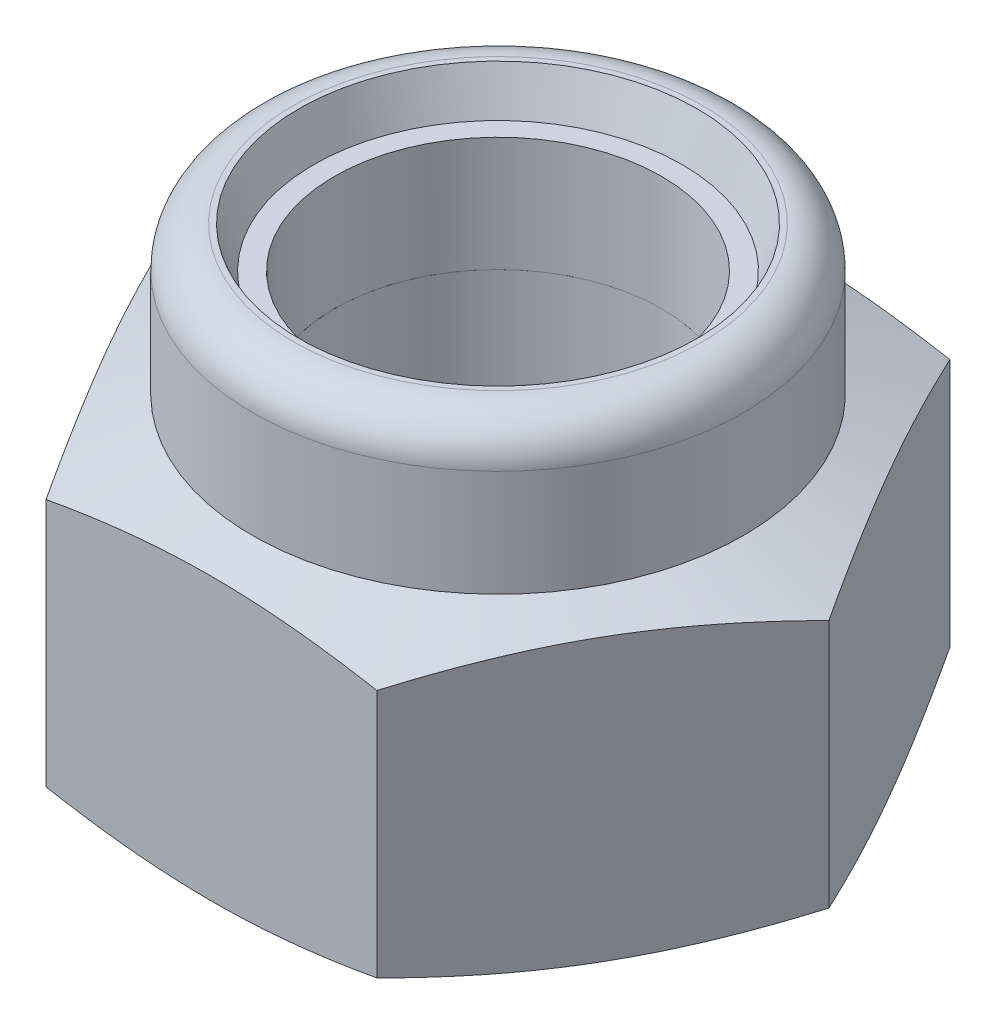
ISO-10303-21;
HEADER;
FILE_DESCRIPTION(('STEP AP214'),'2;1');
FILE_NAME('part.step','',(''),(''),'','','');
FILE_SCHEMA(('AUTOMOTIVE_DESIGN { 1 0 10303 214 1 1 1 1 }'));
ENDSEC;
DATA;
#1=APPLICATION_CONTEXT('core data for automotive mechanical design processes');
#2=APPLICATION_PROTOCOL_DEFINITION('international standard','automotive_design',2000,#1);
#3=PRODUCT_CONTEXT('',#1,'mechanical');
#4=PRODUCT('Part','Part','',(#3));
#5=PRODUCT_RELATED_PRODUCT_CATEGORY('part','',(#4));
#6=PRODUCT_DEFINITION_FORMATION('','',#4);
#7=PRODUCT_DEFINITION_CONTEXT('part definition',#1,'design');
#8=PRODUCT_DEFINITION('design','',#6,#7);
#9=PRODUCT_DEFINITION_SHAPE('','',#8);
#10=(LENGTH_UNIT() NAMED_UNIT(*) SI_UNIT(.MILLI.,.METRE.));
#11=(NAMED_UNIT(*) PLANE_ANGLE_UNIT() SI_UNIT($,.RADIAN.));
#12=(NAMED_UNIT(*) SI_UNIT($,.STERADIAN.) SOLID_ANGLE_UNIT());
#13=UNCERTAINTY_MEASURE_WITH_UNIT(LENGTH_MEASURE(1.E-05),#10,'distance_accuracy_value','');
#14=(GEOMETRIC_REPRESENTATION_CONTEXT(3) GLOBAL_UNCERTAINTY_ASSIGNED_CONTEXT((#13)) GLOBAL_UNIT_ASSIGNED_CONTEXT((#10,
#11,#12)) REPRESENTATION_CONTEXT('',''));
#15=CARTESIAN_POINT('',(0.,0.,0.));
#16=DIRECTION('',(0.,0.,1.));
#17=DIRECTION('',(1.,0.,0.));
#18=AXIS2_PLACEMENT_3D('',#15,#16,#17);
#19=CARTESIAN_POINT('',(0.,3.7,0.));
#20=DIRECTION('',(0.,1.,0.));
#21=DIRECTION('',(0.,0.,1.));
#22=AXIS2_PLACEMENT_3D('',#19,#20,#21);
#23=PLANE('',#22);
#24=CARTESIAN_POINT('',(0.,3.7,0.));
#25=DIRECTION('',(0.,1.,0.));
#26=DIRECTION('',(0.,0.,1.));
#27=AXIS2_PLACEMENT_3D('',#24,#25,#26);
#28=CIRCLE('',#27,2.5);
#29=CARTESIAN_POINT('',(0.,3.7,2.5));
#30=VERTEX_POINT('',#29);
#31=EDGE_CURVE('E58',#30,#30,#28,.T.);
#32=ORIENTED_EDGE('',*,*,#31,.F.);
#33=EDGE_LOOP('',(#32));
#34=FACE_BOUND('',#33,.T.);
#35=CARTESIAN_POINT('',(0.,3.7,0.));
#36=DIRECTION('',(0.,1.,0.));
#37=DIRECTION('',(0.,0.,1.));
#38=AXIS2_PLACEMENT_3D('',#35,#36,#37);
#39=CIRCLE('',#38,2.);
#40=CARTESIAN_POINT('',(0.,3.7,2.));
#41=VERTEX_POINT('',#40);
#42=EDGE_CURVE('E67',#41,#41,#39,.T.);
#43=ORIENTED_EDGE('',*,*,#42,.T.);
#44=EDGE_LOOP('',(#43));
#45=FACE_BOUND('',#44,.T.);
#46=ADVANCED_FACE('F51',(#34,#45),#23,.F.);
#47=CARTESIAN_POINT('',(0.,12.1710678118655,0.));
#48=DIRECTION('',(0.,-1.,0.));
#49=DIRECTION('',(0.,0.,-1.));
#50=AXIS2_PLACEMENT_3D('',#47,#48,#49);
#51=CYLINDRICAL_SURFACE('',#50,2.5);
#52=CARTESIAN_POINT('',(0.,5.1,0.));
#53=DIRECTION('',(0.,-1.,0.));
#54=DIRECTION('',(0.,0.,-1.));
#55=AXIS2_PLACEMENT_3D('',#52,#53,#54);
#56=CIRCLE('',#55,2.5);
#57=CARTESIAN_POINT('',(0.,5.1,-2.5));
#58=VERTEX_POINT('',#57);
#59=EDGE_CURVE('E62',#58,#58,#56,.T.);
#60=ORIENTED_EDGE('',*,*,#59,.T.);
#61=EDGE_LOOP('',(#60));
#62=FACE_BOUND('',#61,.T.);
#63=ORIENTED_EDGE('',*,*,#31,.T.);
#64=EDGE_LOOP('',(#63));
#65=FACE_BOUND('',#64,.T.);
#66=ADVANCED_FACE('F75',(#62,#65),#51,.T.);
#67=CARTESIAN_POINT('',(0.,12.1710678118655,0.));
#68=DIRECTION('',(0.,-1.,0.));
#69=DIRECTION('',(0.,0.,-1.));
#70=AXIS2_PLACEMENT_3D('',#67,#68,#69);
#71=CYLINDRICAL_SURFACE('',#70,2.);
#72=CARTESIAN_POINT('',(0.,5.1,0.));
#73=DIRECTION('',(0.,-1.,0.));
#74=DIRECTION('',(0.,0.,-1.));
#75=AXIS2_PLACEMENT_3D('',#72,#73,#74);
#76=CIRCLE('',#75,2.);
#77=CARTESIAN_POINT('',(0.,5.1,-2.));
#78=VERTEX_POINT('',#77);
#79=EDGE_CURVE('E11',#78,#78,#76,.T.);
#80=ORIENTED_EDGE('',*,*,#79,.F.);
#81=EDGE_LOOP('',(#80));
#82=FACE_BOUND('',#81,.T.);
#83=ORIENTED_EDGE('',*,*,#42,.F.);
#84=EDGE_LOOP('',(#83));
#85=FACE_BOUND('',#84,.T.);
#86=ADVANCED_FACE('F73',(#82,#85),#71,.F.);
#87=CARTESIAN_POINT('',(2.5,5.1,0.));
#88=DIRECTION('',(0.,-1.,0.));
#89=DIRECTION('',(0.,0.,-1.));
#90=AXIS2_PLACEMENT_3D('',#87,#88,#89);
#91=PLANE('',#90);
#92=ORIENTED_EDGE('',*,*,#79,.T.);
#93=EDGE_LOOP('',(#92));
#94=FACE_BOUND('',#93,.T.);
#95=ORIENTED_EDGE('',*,*,#59,.F.);
#96=EDGE_LOOP('',(#95));
#97=FACE_BOUND('',#96,.T.);
#98=ADVANCED_FACE('F53',(#94,#97),#91,.F.);
#99=CLOSED_SHELL('',(#46,#66,#86,#98));
#100=MANIFOLD_SOLID_BREP('B2',#99);
#101=CARTESIAN_POINT('',(0.,0.17320508075689,0.));
#102=DIRECTION('',(0.,-1.,0.));
#103=DIRECTION('',(0.,0.,-1.));
#104=AXIS2_PLACEMENT_3D('',#101,#102,#103);
#105=CONICAL_SURFACE('',#104,2.,1.04719755119659);
#106=CARTESIAN_POINT('',(0.,0.,0.));
#107=DIRECTION('',(0.,-1.,0.));
#108=DIRECTION('',(0.,0.,-1.));
#109=AXIS2_PLACEMENT_3D('',#106,#107,#108);
#110=CIRCLE('',#109,2.3);
#111=CARTESIAN_POINT('',(0.,0.,-2.3));
#112=VERTEX_POINT('',#111);
#113=EDGE_CURVE('E222',#112,#112,#110,.T.);
#114=ORIENTED_EDGE('',*,*,#113,.T.);
#115=EDGE_LOOP('',(#114));
#116=FACE_BOUND('',#115,.T.);
#117=CARTESIAN_POINT('',(0.,0.17320508075689,0.));
#118=DIRECTION('',(0.,-1.,0.));
#119=DIRECTION('',(0.,0.,-1.));
#120=AXIS2_PLACEMENT_3D('',#117,#118,#119);
#121=CIRCLE('',#120,2.);
#122=CARTESIAN_POINT('',(0.,0.17320508075689,-2.));
#123=VERTEX_POINT('',#122);
#124=EDGE_CURVE('E193',#123,#123,#121,.T.);
#125=ORIENTED_EDGE('',*,*,#124,.F.);
#126=EDGE_LOOP('',(#125));
#127=FACE_BOUND('',#126,.T.);
#128=ADVANCED_FACE('F113',(#116,#127),#105,.F.);
#129=CARTESIAN_POINT('',(2.3,0.,0.));
#130=DIRECTION('',(0.,-1.,0.));
#131=DIRECTION('',(0.,0.,-1.));
#132=AXIS2_PLACEMENT_3D('',#129,#130,#131);
#133=PLANE('',#132);
#134=CARTESIAN_POINT('',(0.,0.,0.));
#135=DIRECTION('',(0.,-1.,0.));
#136=DIRECTION('',(0.,0.,-1.));
#137=AXIS2_PLACEMENT_3D('',#134,#135,#136);
#138=CIRCLE('',#137,3.);
#139=CARTESIAN_POINT('',(0.,0.,-3.));
#140=VERTEX_POINT('',#139);
#141=EDGE_CURVE('E316',#140,#140,#138,.T.);
#142=ORIENTED_EDGE('',*,*,#141,.T.);
#143=EDGE_LOOP('',(#142));
#144=FACE_BOUND('',#143,.T.);
#145=ORIENTED_EDGE('',*,*,#113,.F.);
#146=EDGE_LOOP('',(#145));
#147=FACE_BOUND('',#146,.T.);
#148=ADVANCED_FACE('F323',(#144,#147),#133,.T.);
#149=CARTESIAN_POINT('',(0.,-0.041635430402974,0.));
#150=DIRECTION('',(0.,-1.,0.));
#151=DIRECTION('',(0.,0.,-1.));
#152=AXIS2_PLACEMENT_3D('',#149,#150,#151);
#153=CYLINDRICAL_SURFACE('',#152,3.);
#154=CARTESIAN_POINT('',(0.,3.8,0.));
#155=DIRECTION('',(0.,-1.,0.));
#156=DIRECTION('',(0.,0.,-1.));
#157=AXIS2_PLACEMENT_3D('',#154,#155,#156);
#158=CIRCLE('',#157,3.);
#159=CARTESIAN_POINT('',(0.,3.8,-3.));
#160=VERTEX_POINT('',#159);
#161=EDGE_CURVE('E314',#160,#160,#158,.T.);
#162=ORIENTED_EDGE('',*,*,#161,.F.);
#163=EDGE_LOOP('',(#162));
#164=FACE_BOUND('',#163,.T.);
#165=CARTESIAN_POINT('',(0.,5.1,0.));
#166=DIRECTION('',(0.,-1.,0.));
#167=DIRECTION('',(0.,0.,-1.));
#168=AXIS2_PLACEMENT_3D('',#165,#166,#167);
#169=CIRCLE('',#168,3.);
#170=CARTESIAN_POINT('',(0.,5.1,-3.));
#171=VERTEX_POINT('',#170);
#172=EDGE_CURVE('E219',#171,#171,#169,.T.);
#173=ORIENTED_EDGE('',*,*,#172,.T.);
#174=EDGE_LOOP('',(#173));
#175=FACE_BOUND('',#174,.T.);
#176=ADVANCED_FACE('F326',(#164,#175),#153,.T.);
#177=CARTESIAN_POINT('',(0.,5.1,0.));
#178=DIRECTION('',(0.,-1.,0.));
#179=DIRECTION('',(0.,0.,-1.));
#180=AXIS2_PLACEMENT_3D('',#177,#178,#179);
#181=TOROIDAL_SURFACE('',#180,2.5,0.5);
#182=CARTESIAN_POINT('',(0.,5.6,0.));
#183=DIRECTION('',(0.,-1.,0.));
#184=DIRECTION('',(0.,0.,-1.));
#185=AXIS2_PLACEMENT_3D('',#182,#183,#184);
#186=CIRCLE('',#185,2.5);
#187=CARTESIAN_POINT('',(0.,5.6,-2.5));
#188=VERTEX_POINT('',#187);
#189=EDGE_CURVE('E216',#188,#188,#186,.T.);
#190=ORIENTED_EDGE('',*,*,#189,.T.);
#191=EDGE_LOOP('',(#190));
#192=FACE_BOUND('',#191,.T.);
#193=ORIENTED_EDGE('',*,*,#172,.F.);
#194=EDGE_LOOP('',(#193));
#195=FACE_BOUND('',#194,.T.);
#196=ADVANCED_FACE('F363',(#192,#195),#181,.T.);
#197=CARTESIAN_POINT('',(2.5,5.6,0.));
#198=DIRECTION('',(0.,1.,0.));
#199=DIRECTION('',(0.,0.,1.));
#200=AXIS2_PLACEMENT_3D('',#197,#198,#199);
#201=PLANE('',#200);
#202=CARTESIAN_POINT('',(0.,5.6,0.));
#203=DIRECTION('',(0.,-1.,0.));
#204=DIRECTION('',(0.,0.,-1.));
#205=AXIS2_PLACEMENT_3D('',#202,#203,#204);
#206=CIRCLE('',#205,2.4319851171331);
#207=CARTESIAN_POINT('',(0.,5.6,-2.4319851171331));
#208=VERTEX_POINT('',#207);
#209=EDGE_CURVE('E213',#208,#208,#206,.T.);
#210=ORIENTED_EDGE('',*,*,#209,.T.);
#211=EDGE_LOOP('',(#210));
#212=FACE_BOUND('',#211,.T.);
#213=ORIENTED_EDGE('',*,*,#189,.F.);
#214=EDGE_LOOP('',(#213));
#215=FACE_BOUND('',#214,.T.);
#216=ADVANCED_FACE('F359',(#212,#215),#201,.T.);
#217=CARTESIAN_POINT('',(0.,5.6,0.));
#218=DIRECTION('',(0.,1.,0.));
#219=DIRECTION('',(0.,0.,1.));
#220=AXIS2_PLACEMENT_3D('',#217,#218,#219);
#221=CONICAL_SURFACE('',#220,2.4319851171331,0.349065850398862);
#222=CARTESIAN_POINT('',(0.,5.1,0.));
#223=DIRECTION('',(0.,-1.,0.));
#224=DIRECTION('',(0.,0.,-1.));
#225=AXIS2_PLACEMENT_3D('',#222,#223,#224);
#226=CIRCLE('',#225,2.25);
#227=CARTESIAN_POINT('',(0.,5.1,-2.25));
#228=VERTEX_POINT('',#227);
#229=EDGE_CURVE('E210',#228,#228,#226,.T.);
#230=ORIENTED_EDGE('',*,*,#229,.T.);
#231=EDGE_LOOP('',(#230));
#232=FACE_BOUND('',#231,.T.);
#233=ORIENTED_EDGE('',*,*,#209,.F.);
#234=EDGE_LOOP('',(#233));
#235=FACE_BOUND('',#234,.T.);
#236=ADVANCED_FACE('F352',(#232,#235),#221,.F.);
#237=CARTESIAN_POINT('',(2.5,5.1,0.));
#238=DIRECTION('',(0.,-1.,0.));
#239=DIRECTION('',(0.,0.,-1.));
#240=AXIS2_PLACEMENT_3D('',#237,#238,#239);
#241=PLANE('',#240);
#242=CARTESIAN_POINT('',(0.,5.1,0.));
#243=DIRECTION('',(0.,-1.,0.));
#244=DIRECTION('',(0.,0.,-1.));
#245=AXIS2_PLACEMENT_3D('',#242,#243,#244);
#246=CIRCLE('',#245,2.5);
#247=CARTESIAN_POINT('',(0.,5.1,-2.5));
#248=VERTEX_POINT('',#247);
#249=EDGE_CURVE('E207',#248,#248,#246,.T.);
#250=ORIENTED_EDGE('',*,*,#249,.T.);
#251=EDGE_LOOP('',(#250));
#252=FACE_BOUND('',#251,.T.);
#253=ORIENTED_EDGE('',*,*,#229,.F.);
#254=EDGE_LOOP('',(#253));
#255=FACE_BOUND('',#254,.T.);
#256=ADVANCED_FACE('F345',(#252,#255),#241,.T.);
#257=CARTESIAN_POINT('',(0.,-0.041635430402974,0.));
#258=DIRECTION('',(0.,-1.,0.));
#259=DIRECTION('',(0.,0.,-1.));
#260=AXIS2_PLACEMENT_3D('',#257,#258,#259);
#261=CYLINDRICAL_SURFACE('',#260,2.5);
#262=ORIENTED_EDGE('',*,*,#249,.F.);
#263=EDGE_LOOP('',(#262));
#264=FACE_BOUND('',#263,.T.);
#265=CARTESIAN_POINT('',(0.,3.7,0.));
#266=DIRECTION('',(0.,-1.,0.));
#267=DIRECTION('',(0.,0.,-1.));
#268=AXIS2_PLACEMENT_3D('',#265,#266,#267);
#269=CIRCLE('',#268,2.5);
#270=CARTESIAN_POINT('',(0.,3.7,-2.5));
#271=VERTEX_POINT('',#270);
#272=EDGE_CURVE('E204',#271,#271,#269,.T.);
#273=ORIENTED_EDGE('',*,*,#272,.T.);
#274=EDGE_LOOP('',(#273));
#275=FACE_BOUND('',#274,.T.);
#276=ADVANCED_FACE('F340',(#264,#275),#261,.F.);
#277=CARTESIAN_POINT('',(2.,3.7,0.));
#278=DIRECTION('',(0.,1.,0.));
#279=DIRECTION('',(0.,0.,1.));
#280=AXIS2_PLACEMENT_3D('',#277,#278,#279);
#281=PLANE('',#280);
#282=CARTESIAN_POINT('',(0.,3.7,0.));
#283=DIRECTION('',(0.,-1.,0.));
#284=DIRECTION('',(0.,0.,-1.));
#285=AXIS2_PLACEMENT_3D('',#282,#283,#284);
#286=CIRCLE('',#285,2.);
#287=CARTESIAN_POINT('',(0.,3.7,-2.));
#288=VERTEX_POINT('',#287);
#289=EDGE_CURVE('E201',#288,#288,#286,.T.);
#290=ORIENTED_EDGE('',*,*,#289,.T.);
#291=EDGE_LOOP('',(#290));
#292=FACE_BOUND('',#291,.T.);
#293=ORIENTED_EDGE('',*,*,#272,.F.);
#294=EDGE_LOOP('',(#293));
#295=FACE_BOUND('',#294,.T.);
#296=ADVANCED_FACE('F335',(#292,#295),#281,.T.);
#297=CARTESIAN_POINT('',(0.,-0.041635430402974,0.));
#298=DIRECTION('',(0.,-1.,0.));
#299=DIRECTION('',(0.,0.,-1.));
#300=AXIS2_PLACEMENT_3D('',#297,#298,#299);
#301=CYLINDRICAL_SURFACE('',#300,2.);
#302=ORIENTED_EDGE('',*,*,#124,.T.);
#303=EDGE_LOOP('',(#302));
#304=FACE_BOUND('',#303,.T.);
#305=ORIENTED_EDGE('',*,*,#289,.F.);
#306=EDGE_LOOP('',(#305));
#307=FACE_BOUND('',#306,.T.);
#308=ADVANCED_FACE('F235',(#304,#307),#301,.F.);
#309=CARTESIAN_POINT('',(0.,0.,0.));
#310=DIRECTION('',(0.,1.,0.));
#311=DIRECTION('',(0.,0.,1.));
#312=AXIS2_PLACEMENT_3D('',#309,#310,#311);
#313=CONICAL_SURFACE('',#312,3.,1.22173047639604);
#314=ORIENTED_EDGE('',*,*,#141,.F.);
#315=EDGE_LOOP('',(#314));
#316=FACE_BOUND('',#315,.T.);
#317=CARTESIAN_POINT('',(4.04156735438122,0.379099515779287,-0.000199999999999952));
#318=CARTESIAN_POINT('',(3.95787514809881,0.348625423813097,0.144759153478659));
#319=CARTESIAN_POINT('',(3.87390694539185,0.320903869856063,0.290196346787368));
#320=CARTESIAN_POINT('',(3.70542452281811,0.272131970386294,0.582016462867364));
#321=CARTESIAN_POINT('',(3.62090992809117,0.251086846140244,0.72840003491553));
#322=CARTESIAN_POINT('',(3.45227272371677,0.217046919435374,1.02048824093836));
#323=CARTESIAN_POINT('',(3.36815396607547,0.203977864339673,1.16618620304267));
#324=CARTESIAN_POINT('',(3.19971971959109,0.186448577530887,1.45792287568819));
#325=CARTESIAN_POINT('',(3.11540431641831,0.181985117133098,1.60396143784409));
#326=CARTESIAN_POINT('',(2.94677351007276,0.181985117133098,1.89603856215591));
#327=CARTESIAN_POINT('',(2.86245810689998,0.186448577530887,2.04207712431181));
#328=CARTESIAN_POINT('',(2.6940238604156,0.203977864339673,2.33381379695733));
#329=CARTESIAN_POINT('',(2.6099051027743,0.217046919435374,2.47951175906164));
#330=CARTESIAN_POINT('',(2.4412678983999,0.251086846140244,2.77159996508447));
#331=CARTESIAN_POINT('',(2.35675330367296,0.272131970386294,2.91798353713264));
#332=CARTESIAN_POINT('',(2.18827088109922,0.320903869856063,3.20980365321263));
#333=CARTESIAN_POINT('',(2.10430267839226,0.348625423813097,3.35524084652134));
#334=CARTESIAN_POINT('',(2.02061047210985,0.379099515779287,3.5002));
#335=B_SPLINE_CURVE_WITH_KNOTS('',3,(#317,#318,#319,#320,#321,#322,#323,#324,#325,#326,#327,
#328,#329,#330,#331,#332,#333,#334),.UNSPECIFIED.,.F.,.F.,(4,2,2,2,2,2,2,2,4),(0.,
0.510460249306824,1.02131872285996,1.52734581347643,2.03318301365992,2.53902021384341,
3.04504730445988,3.55590577801302,4.06636602731984),.UNSPECIFIED.);
#336=CARTESIAN_POINT('',(4.04145188432738,0.379057486315607,0.));
#337=VERTEX_POINT('',#336);
#338=CARTESIAN_POINT('',(2.02072594216369,0.379057486315608,3.5));
#339=VERTEX_POINT('',#338);
#340=EDGE_CURVE('E140',#337,#339,#335,.T.);
#341=ORIENTED_EDGE('',*,*,#340,.T.);
#342=CARTESIAN_POINT('',(6.08011525916594,1.46153703640262,3.5));
#343=CARTESIAN_POINT('',(5.96012863506672,1.42369027366622,3.5));
#344=CARTESIAN_POINT('',(5.84006314921599,1.38609355172634,3.5));
#345=CARTESIAN_POINT('',(5.59974892242889,1.31148497442099,3.5));
#346=CARTESIAN_POINT('',(5.47950017907776,1.27447312683671,3.5));
#347=CARTESIAN_POINT('',(5.11839186384537,1.1644272163015,3.5));
#348=CARTESIAN_POINT('',(4.87722371148536,1.09239974518215,3.5));
#349=CARTESIAN_POINT('',(4.39025197801831,0.950946453576852,3.5));
#350=CARTESIAN_POINT('',(4.14443256987769,0.881574823199854,3.5));
#351=CARTESIAN_POINT('',(3.65137880729657,0.748044039794964,3.5));
#352=CARTESIAN_POINT('',(3.40414450734381,0.683884687468052,3.5));
#353=CARTESIAN_POINT('',(2.9184587525731,0.565504743823072,3.5));
#354=CARTESIAN_POINT('',(2.68008328770867,0.510976662638159,3.5));
#355=CARTESIAN_POINT('',(2.20132722626554,0.411302854936206,3.5));
#356=CARTESIAN_POINT('',(1.96094649317481,0.366157772694595,3.5));
#357=CARTESIAN_POINT('',(1.4799244855891,0.288979007389936,3.5));
#358=CARTESIAN_POINT('',(1.23929985635332,0.256845838328097,3.5));
#359=CARTESIAN_POINT('',(0.877196698566188,0.220703503049321,3.5));
#360=CARTESIAN_POINT('',(0.756310940655288,0.210665946759483,3.5));
#361=CARTESIAN_POINT('',(0.514260401469212,0.194933891897553,3.5));
#362=CARTESIAN_POINT('',(0.393095640470899,0.189239087118184,3.5));
#363=CARTESIAN_POINT('',(0.139805986231256,0.182100477712558,3.5));
#364=CARTESIAN_POINT('',(0.00766880956837667,0.181081813603101,3.5));
#365=CARTESIAN_POINT('',(-0.256535111287094,0.184498075842278,3.5));
#366=CARTESIAN_POINT('',(-0.38860185454883,0.188933072563697,3.5));
#367=CARTESIAN_POINT('',(-0.652485589160061,0.2030611739534,3.5));
#368=CARTESIAN_POINT('',(-0.784302505221764,0.212755668899889,3.5));
#369=CARTESIAN_POINT('',(-1.04749323491778,0.237005396398,3.5));
#370=CARTESIAN_POINT('',(-1.17886700443125,0.251561099309427,3.5));
#371=CARTESIAN_POINT('',(-1.57432757136072,0.302015022976691,3.5));
#372=CARTESIAN_POINT('',(-1.83756976648338,0.344567754222752,3.5));
#373=CARTESIAN_POINT('',(-2.36154295085857,0.442654796580093,3.5));
#374=CARTESIAN_POINT('',(-2.62227372262056,0.498190221660417,3.5));
#375=CARTESIAN_POINT('',(-3.15412571574673,0.621240308982856,3.5));
#376=CARTESIAN_POINT('',(-3.42514165021264,0.6892035128855,3.5));
#377=CARTESIAN_POINT('',(-3.96533783384239,0.83195585334451,3.5));
#378=CARTESIAN_POINT('',(-4.23451811856197,0.906744857282153,3.5));
#379=CARTESIAN_POINT('',(-4.76701519138797,1.05977329094661,3.5));
#380=CARTESIAN_POINT('',(-5.0303547319324,1.13793405795395,3.5));
#381=CARTESIAN_POINT('',(-5.42457721812843,1.25762448498027,3.5));
#382=CARTESIAN_POINT('',(-5.55583636791992,1.29792404661646,3.5));
#383=CARTESIAN_POINT('',(-5.81813330524712,1.37922911379127,3.5));
#384=CARTESIAN_POINT('',(-5.94917109681677,1.42023460630947,3.5));
#385=CARTESIAN_POINT('',(-6.08011525916594,1.46153703640262,3.5));
#386=B_SPLINE_CURVE_WITH_KNOTS('',3,(#342,#343,#344,#345,#346,#347,#348,#349,#350,#351,#352,
#353,#354,#355,#356,#357,#358,#359,#360,#361,#362,#363,#364,#365,#366,#367,#368,#369,#370,#371,
#372,#373,#374,#375,#376,#377,#378,#379,#380,#381,#382,#383,#384,#385),.UNSPECIFIED.,.F.,.F.,(4,
2,2,2,2,2,2,2,2,2,2,2,2,2,2,2,2,2,2,2,2,4),(0.,0.377441536839362,0.754888090944882,
1.50994957596214,2.27617141665536,3.04236394594129,3.77582529562351,4.50933699116282,
5.23712944080594,5.60096777851802,5.96478045962729,6.36108941943882,6.75740349318355,
7.1538223783467,7.55027963124832,8.34974313081487,9.14927525286383,9.98736468406917,
10.8254378354689,11.6494894338918,12.0614069174551,12.473316811605),.UNSPECIFIED.);
#387=CARTESIAN_POINT('',(-2.02072594216369,0.379057486315607,3.5));
#388=VERTEX_POINT('',#387);
#389=EDGE_CURVE('E126',#339,#388,#386,.T.);
#390=ORIENTED_EDGE('',*,*,#389,.T.);
#391=CARTESIAN_POINT('',(-2.02061047210985,0.379099515779287,3.5002));
#392=CARTESIAN_POINT('',(-2.10430267839226,0.348625423813097,3.35524084652134));
#393=CARTESIAN_POINT('',(-2.18827088109922,0.320903869856063,3.20980365321263));
#394=CARTESIAN_POINT('',(-2.35675330367296,0.272131970386294,2.91798353713264));
#395=CARTESIAN_POINT('',(-2.4412678983999,0.251086846140244,2.77159996508447));
#396=CARTESIAN_POINT('',(-2.6099051027743,0.217046919435374,2.47951175906164));
#397=CARTESIAN_POINT('',(-2.6940238604156,0.203977864339673,2.33381379695733));
#398=CARTESIAN_POINT('',(-2.86245810689998,0.186448577530887,2.04207712431181));
#399=CARTESIAN_POINT('',(-2.94677351007276,0.181985117133098,1.89603856215591));
#400=CARTESIAN_POINT('',(-3.11540431641831,0.181985117133098,1.60396143784409));
#401=CARTESIAN_POINT('',(-3.19971971959109,0.186448577530887,1.45792287568819));
#402=CARTESIAN_POINT('',(-3.36815396607547,0.203977864339673,1.16618620304267));
#403=CARTESIAN_POINT('',(-3.45227272371677,0.217046919435374,1.02048824093836));
#404=CARTESIAN_POINT('',(-3.62090992809117,0.251086846140244,0.72840003491553));
#405=CARTESIAN_POINT('',(-3.70542452281811,0.272131970386294,0.582016462867364));
#406=CARTESIAN_POINT('',(-3.87390694539185,0.320903869856063,0.290196346787368));
#407=CARTESIAN_POINT('',(-3.95787514809881,0.348625423813096,0.144759153478658));
#408=CARTESIAN_POINT('',(-4.04156735438122,0.379099515779287,-0.000200000000000917));
#409=B_SPLINE_CURVE_WITH_KNOTS('',3,(#391,#392,#393,#394,#395,#396,#397,#398,#399,#400,#401,
#402,#403,#404,#405,#406,#407,#408),.UNSPECIFIED.,.F.,.F.,(4,2,2,2,2,2,2,2,4),(0.,
0.510460249306825,1.02131872285996,1.52734581347644,2.03318301365992,2.53902021384341,
3.04504730445988,3.55590577801302,4.06636602731985),.UNSPECIFIED.);
#410=CARTESIAN_POINT('',(-4.04145188432738,0.379057486315607,0.));
#411=VERTEX_POINT('',#410);
#412=EDGE_CURVE('E244',#388,#411,#409,.T.);
#413=ORIENTED_EDGE('',*,*,#412,.T.);
#414=CARTESIAN_POINT('',(-4.04156735438122,0.379099515779287,0.000199999999999043));
#415=CARTESIAN_POINT('',(-3.95787514809882,0.348625423813097,-0.14475915347866));
#416=CARTESIAN_POINT('',(-3.87390694539185,0.320903869856063,-0.290196346787369));
#417=CARTESIAN_POINT('',(-3.70542452281811,0.272131970386294,-0.582016462867365));
#418=CARTESIAN_POINT('',(-3.62090992809117,0.251086846140244,-0.728400034915531));
#419=CARTESIAN_POINT('',(-3.45227272371677,0.217046919435374,-1.02048824093836));
#420=CARTESIAN_POINT('',(-3.36815396607547,0.203977864339673,-1.16618620304267));
#421=CARTESIAN_POINT('',(-3.19971971959109,0.186448577530888,-1.45792287568819));
#422=CARTESIAN_POINT('',(-3.11540431641831,0.181985117133098,-1.60396143784409));
#423=CARTESIAN_POINT('',(-2.94677351007276,0.181985117133098,-1.89603856215591));
#424=CARTESIAN_POINT('',(-2.86245810689998,0.186448577530888,-2.04207712431181));
#425=CARTESIAN_POINT('',(-2.6940238604156,0.203977864339673,-2.33381379695733));
#426=CARTESIAN_POINT('',(-2.6099051027743,0.217046919435374,-2.47951175906164));
#427=CARTESIAN_POINT('',(-2.4412678983999,0.251086846140244,-2.77159996508447));
#428=CARTESIAN_POINT('',(-2.35675330367296,0.272131970386294,-2.91798353713264));
#429=CARTESIAN_POINT('',(-2.18827088109922,0.320903869856063,-3.20980365321263));
#430=CARTESIAN_POINT('',(-2.10430267839226,0.348625423813097,-3.35524084652134));
#431=CARTESIAN_POINT('',(-2.02061047210985,0.379099515779287,-3.5002));
#432=B_SPLINE_CURVE_WITH_KNOTS('',3,(#414,#415,#416,#417,#418,#419,#420,#421,#422,#423,#424,
#425,#426,#427,#428,#429,#430,#431),.UNSPECIFIED.,.F.,.F.,(4,2,2,2,2,2,2,2,4),(0.,
0.510460249306824,1.02131872285996,1.52734581347643,2.03318301365992,2.53902021384341,
3.04504730445988,3.55590577801302,4.06636602731984),.UNSPECIFIED.);
#433=CARTESIAN_POINT('',(-2.02072594216369,0.379057486315607,-3.5));
#434=VERTEX_POINT('',#433);
#435=EDGE_CURVE('E173',#411,#434,#432,.T.);
#436=ORIENTED_EDGE('',*,*,#435,.T.);
#437=CARTESIAN_POINT('',(-6.08011525916595,1.46153703640262,-3.5));
#438=CARTESIAN_POINT('',(-5.96012863506673,1.42369027366622,-3.5));
#439=CARTESIAN_POINT('',(-5.840063149216,1.38609355172634,-3.5));
#440=CARTESIAN_POINT('',(-5.59974892242889,1.31148497442099,-3.5));
#441=CARTESIAN_POINT('',(-5.47950017907776,1.27447312683671,-3.5));
#442=CARTESIAN_POINT('',(-5.11839186384537,1.1644272163015,-3.5));
#443=CARTESIAN_POINT('',(-4.87722371148536,1.09239974518215,-3.5));
#444=CARTESIAN_POINT('',(-4.39025197801831,0.950946453576852,-3.5));
#445=CARTESIAN_POINT('',(-4.14443256987769,0.881574823199854,-3.5));
#446=CARTESIAN_POINT('',(-3.65137880729657,0.748044039794964,-3.5));
#447=CARTESIAN_POINT('',(-3.40414450734381,0.683884687468052,-3.5));
#448=CARTESIAN_POINT('',(-2.9184587525731,0.565504743823072,-3.5));
#449=CARTESIAN_POINT('',(-2.68008328770867,0.510976662638159,-3.5));
#450=CARTESIAN_POINT('',(-2.20132722626554,0.411302854936206,-3.5));
#451=CARTESIAN_POINT('',(-1.96094649317481,0.366157772694595,-3.5));
#452=CARTESIAN_POINT('',(-1.4799244855891,0.288979007389935,-3.5));
#453=CARTESIAN_POINT('',(-1.23929985635332,0.256845838328096,-3.5));
#454=CARTESIAN_POINT('',(-0.877196698566187,0.22070350304932,-3.5));
#455=CARTESIAN_POINT('',(-0.756310940655288,0.210665946759482,-3.5));
#456=CARTESIAN_POINT('',(-0.514260401469212,0.194933891897553,-3.5));
#457=CARTESIAN_POINT('',(-0.393095640470898,0.189239087118184,-3.5));
#458=CARTESIAN_POINT('',(-0.139805986231255,0.182100477712558,-3.5));
#459=CARTESIAN_POINT('',(-0.0076688095683757,0.181081813603101,-3.5));
#460=CARTESIAN_POINT('',(0.256535111287095,0.184498075842278,-3.5));
#461=CARTESIAN_POINT('',(0.388601854548831,0.188933072563696,-3.5));
#462=CARTESIAN_POINT('',(0.652485589160062,0.2030611739534,-3.5));
#463=CARTESIAN_POINT('',(0.784302505221765,0.212755668899889,-3.5));
#464=CARTESIAN_POINT('',(1.04749323491778,0.237005396398,-3.5));
#465=CARTESIAN_POINT('',(1.17886700443125,0.251561099309427,-3.5));
#466=CARTESIAN_POINT('',(1.57432757136072,0.302015022976691,-3.5));
#467=CARTESIAN_POINT('',(1.83756976648338,0.344567754222752,-3.5));
#468=CARTESIAN_POINT('',(2.36154295085857,0.442654796580093,-3.5));
#469=CARTESIAN_POINT('',(2.62227372262056,0.498190221660417,-3.5));
#470=CARTESIAN_POINT('',(3.15412571574673,0.621240308982856,-3.5));
#471=CARTESIAN_POINT('',(3.42514165021264,0.6892035128855,-3.5));
#472=CARTESIAN_POINT('',(3.96533783384239,0.83195585334451,-3.5));
#473=CARTESIAN_POINT('',(4.23451811856197,0.906744857282153,-3.5));
#474=CARTESIAN_POINT('',(4.76701519138797,1.05977329094661,-3.5));
#475=CARTESIAN_POINT('',(5.0303547319324,1.13793405795395,-3.5));
#476=CARTESIAN_POINT('',(5.42457721812842,1.25762448498027,-3.5));
#477=CARTESIAN_POINT('',(5.55583636791992,1.29792404661646,-3.5));
#478=CARTESIAN_POINT('',(5.81813330524711,1.37922911379127,-3.5));
#479=CARTESIAN_POINT('',(5.94917109681677,1.42023460630947,-3.5));
#480=CARTESIAN_POINT('',(6.08011525916595,1.46153703640262,-3.5));
#481=B_SPLINE_CURVE_WITH_KNOTS('',3,(#437,#438,#439,#440,#441,#442,#443,#444,#445,#446,#447,
#448,#449,#450,#451,#452,#453,#454,#455,#456,#457,#458,#459,#460,#461,#462,#463,#464,#465,#466,
#467,#468,#469,#470,#471,#472,#473,#474,#475,#476,#477,#478,#479,#480),.UNSPECIFIED.,.F.,.F.,(4,
2,2,2,2,2,2,2,2,2,2,2,2,2,2,2,2,2,2,2,2,4),(0.,0.377441536839361,0.754888090944882,
1.50994957596214,2.27617141665537,3.0423639459413,3.77582529562351,4.50933699116282,
5.23712944080594,5.60096777851802,5.96478045962729,6.36108941943882,6.75740349318355,
7.1538223783467,7.55027963124832,8.34974313081487,9.14927525286384,9.98736468406917,
10.8254378354689,11.6494894338918,12.0614069174551,12.473316811605),.UNSPECIFIED.);
#482=CARTESIAN_POINT('',(2.02072594216369,0.379057486315607,-3.5));
#483=VERTEX_POINT('',#482);
#484=EDGE_CURVE('E168',#434,#483,#481,.T.);
#485=ORIENTED_EDGE('',*,*,#484,.T.);
#486=CARTESIAN_POINT('',(2.02061047210985,0.379099515779287,-3.5002));
#487=CARTESIAN_POINT('',(2.10430267839226,0.348625423813096,-3.35524084652134));
#488=CARTESIAN_POINT('',(2.18827088109922,0.320903869856063,-3.20980365321263));
#489=CARTESIAN_POINT('',(2.35675330367296,0.272131970386294,-2.91798353713264));
#490=CARTESIAN_POINT('',(2.4412678983999,0.251086846140244,-2.77159996508447));
#491=CARTESIAN_POINT('',(2.6099051027743,0.217046919435374,-2.47951175906164));
#492=CARTESIAN_POINT('',(2.6940238604156,0.203977864339673,-2.33381379695733));
#493=CARTESIAN_POINT('',(2.86245810689998,0.186448577530887,-2.04207712431181));
#494=CARTESIAN_POINT('',(2.94677351007276,0.181985117133097,-1.89603856215591));
#495=CARTESIAN_POINT('',(3.11540431641831,0.181985117133097,-1.60396143784409));
#496=CARTESIAN_POINT('',(3.19971971959109,0.186448577530887,-1.45792287568819));
#497=CARTESIAN_POINT('',(3.36815396607547,0.203977864339673,-1.16618620304267));
#498=CARTESIAN_POINT('',(3.45227272371677,0.217046919435374,-1.02048824093836));
#499=CARTESIAN_POINT('',(3.62090992809117,0.251086846140244,-0.72840003491553));
#500=CARTESIAN_POINT('',(3.70542452281811,0.272131970386294,-0.582016462867364));
#501=CARTESIAN_POINT('',(3.87390694539185,0.320903869856063,-0.290196346787368));
#502=CARTESIAN_POINT('',(3.95787514809881,0.348625423813097,-0.144759153478658));
#503=CARTESIAN_POINT('',(4.04156735438122,0.379099515779287,0.000200000000000246));
#504=B_SPLINE_CURVE_WITH_KNOTS('',3,(#486,#487,#488,#489,#490,#491,#492,#493,#494,#495,#496,
#497,#498,#499,#500,#501,#502,#503),.UNSPECIFIED.,.F.,.F.,(4,2,2,2,2,2,2,2,4),(0.,
0.510460249306824,1.02131872285996,1.52734581347643,2.03318301365992,2.53902021384341,
3.04504730445988,3.55590577801302,4.06636602731984),.UNSPECIFIED.);
#505=EDGE_CURVE('E171',#483,#337,#504,.T.);
#506=ORIENTED_EDGE('',*,*,#505,.T.);
#507=EDGE_LOOP('',(#341,#390,#413,#436,#485,#506));
#508=FACE_BOUND('',#507,.T.);
#509=ADVANCED_FACE('F170',(#316,#508),#313,.T.);
#510=CARTESIAN_POINT('',(0.,3.42094251368439,0.));
#511=DIRECTION('',(0.,-1.,0.));
#512=DIRECTION('',(0.,0.,-1.));
#513=AXIS2_PLACEMENT_3D('',#510,#511,#512);
#514=CONICAL_SURFACE('',#513,4.04145188432738,1.22173047639604);
#515=ORIENTED_EDGE('',*,*,#161,.T.);
#516=EDGE_LOOP('',(#515));
#517=FACE_BOUND('',#516,.T.);
#518=CARTESIAN_POINT('',(2.02061047210985,3.42090048422071,3.5002));
#519=CARTESIAN_POINT('',(2.10430267839226,3.4513745761869,3.35524084652134));
#520=CARTESIAN_POINT('',(2.18827088109922,3.47909613014394,3.20980365321263));
#521=CARTESIAN_POINT('',(2.35675330367296,3.52786802961371,2.91798353713264));
#522=CARTESIAN_POINT('',(2.4412678983999,3.54891315385976,2.77159996508447));
#523=CARTESIAN_POINT('',(2.6099051027743,3.58295308056463,2.47951175906164));
#524=CARTESIAN_POINT('',(2.6940238604156,3.59602213566033,2.33381379695733));
#525=CARTESIAN_POINT('',(2.86245810689998,3.61355142246911,2.04207712431181));
#526=CARTESIAN_POINT('',(2.94677351007276,3.6180148828669,1.89603856215591));
#527=CARTESIAN_POINT('',(3.11540431641831,3.6180148828669,1.60396143784409));
#528=CARTESIAN_POINT('',(3.19971971959109,3.61355142246911,1.45792287568819));
#529=CARTESIAN_POINT('',(3.36815396607547,3.59602213566033,1.16618620304267));
#530=CARTESIAN_POINT('',(3.45227272371677,3.58295308056463,1.02048824093836));
#531=CARTESIAN_POINT('',(3.62090992809117,3.54891315385976,0.72840003491553));
#532=CARTESIAN_POINT('',(3.70542452281811,3.52786802961371,0.582016462867364));
#533=CARTESIAN_POINT('',(3.87390694539185,3.47909613014394,0.290196346787368));
#534=CARTESIAN_POINT('',(3.95787514809881,3.4513745761869,0.144759153478659));
#535=CARTESIAN_POINT('',(4.04156735438122,3.42090048422071,-0.000200000000000027));
#536=B_SPLINE_CURVE_WITH_KNOTS('',3,(#518,#519,#520,#521,#522,#523,#524,#525,#526,#527,#528,
#529,#530,#531,#532,#533,#534,#535),.UNSPECIFIED.,.F.,.F.,(4,2,2,2,2,2,2,2,4),(0.,
0.510460249306824,1.02131872285996,1.52734581347643,2.03318301365992,2.53902021384341,
3.04504730445988,3.55590577801302,4.06636602731984),.UNSPECIFIED.);
#537=CARTESIAN_POINT('',(2.02072594216369,3.42094251368439,3.5));
#538=VERTEX_POINT('',#537);
#539=CARTESIAN_POINT('',(4.04145188432738,3.42094251368439,0.));
#540=VERTEX_POINT('',#539);
#541=EDGE_CURVE('E288',#538,#540,#536,.T.);
#542=ORIENTED_EDGE('',*,*,#541,.T.);
#543=CARTESIAN_POINT('',(4.04156735438122,3.42090048422071,0.0002000000000001));
#544=CARTESIAN_POINT('',(3.95787514809882,3.4513745761869,-0.144759153478659));
#545=CARTESIAN_POINT('',(3.87390694539185,3.47909613014394,-0.290196346787368));
#546=CARTESIAN_POINT('',(3.70542452281811,3.52786802961371,-0.582016462867364));
#547=CARTESIAN_POINT('',(3.62090992809117,3.54891315385976,-0.72840003491553));
#548=CARTESIAN_POINT('',(3.45227272371677,3.58295308056463,-1.02048824093836));
#549=CARTESIAN_POINT('',(3.36815396607547,3.59602213566033,-1.16618620304267));
#550=CARTESIAN_POINT('',(3.19971971959109,3.61355142246911,-1.45792287568819));
#551=CARTESIAN_POINT('',(3.11540431641831,3.6180148828669,-1.60396143784409));
#552=CARTESIAN_POINT('',(2.94677351007276,3.6180148828669,-1.89603856215591));
#553=CARTESIAN_POINT('',(2.86245810689998,3.61355142246911,-2.04207712431181));
#554=CARTESIAN_POINT('',(2.6940238604156,3.59602213566033,-2.33381379695733));
#555=CARTESIAN_POINT('',(2.6099051027743,3.58295308056463,-2.47951175906164));
#556=CARTESIAN_POINT('',(2.4412678983999,3.54891315385976,-2.77159996508447));
#557=CARTESIAN_POINT('',(2.35675330367296,3.52786802961371,-2.91798353713264));
#558=CARTESIAN_POINT('',(2.18827088109922,3.47909613014394,-3.20980365321263));
#559=CARTESIAN_POINT('',(2.10430267839225,3.4513745761869,-3.35524084652134));
#560=CARTESIAN_POINT('',(2.02061047210985,3.42090048422071,-3.5002));
#561=B_SPLINE_CURVE_WITH_KNOTS('',3,(#543,#544,#545,#546,#547,#548,#549,#550,#551,#552,#553,
#554,#555,#556,#557,#558,#559,#560),.UNSPECIFIED.,.F.,.F.,(4,2,2,2,2,2,2,2,4),(0.,
0.510460249306824,1.02131872285996,1.52734581347643,2.03318301365992,2.53902021384341,
3.04504730445988,3.55590577801302,4.06636602731984),.UNSPECIFIED.);
#562=CARTESIAN_POINT('',(2.02072594216369,3.42094251368439,-3.5));
#563=VERTEX_POINT('',#562);
#564=EDGE_CURVE('E281',#540,#563,#561,.T.);
#565=ORIENTED_EDGE('',*,*,#564,.T.);
#566=CARTESIAN_POINT('',(6.08011525916594,2.33846296359738,-3.5));
#567=CARTESIAN_POINT('',(5.96012863506672,2.37630972633378,-3.5));
#568=CARTESIAN_POINT('',(5.84006314921599,2.41390644827366,-3.5));
#569=CARTESIAN_POINT('',(5.59974892242889,2.48851502557901,-3.5));
#570=CARTESIAN_POINT('',(5.47950017907776,2.52552687316329,-3.5));
#571=CARTESIAN_POINT('',(5.11839186384537,2.6355727836985,-3.5));
#572=CARTESIAN_POINT('',(4.87722371148536,2.70760025481784,-3.5));
#573=CARTESIAN_POINT('',(4.39025197801831,2.84905354642315,-3.5));
#574=CARTESIAN_POINT('',(4.1444325698777,2.91842517680014,-3.5));
#575=CARTESIAN_POINT('',(3.65137880729657,3.05195596020503,-3.5));
#576=CARTESIAN_POINT('',(3.40414450734382,3.11611531253195,-3.5));
#577=CARTESIAN_POINT('',(2.9184587525731,3.23449525617693,-3.5));
#578=CARTESIAN_POINT('',(2.68008328770867,3.28902333736184,-3.5));
#579=CARTESIAN_POINT('',(2.20132722626555,3.38869714506379,-3.5));
#580=CARTESIAN_POINT('',(1.96094649317482,3.4338422273054,-3.5));
#581=CARTESIAN_POINT('',(1.4799244855891,3.51102099261006,-3.5));
#582=CARTESIAN_POINT('',(1.23929985635333,3.5431541616719,-3.5));
#583=CARTESIAN_POINT('',(0.877196698566194,3.57929649695068,-3.5));
#584=CARTESIAN_POINT('',(0.756310940655294,3.58933405324052,-3.5));
#585=CARTESIAN_POINT('',(0.514260401469218,3.60506610810245,-3.5));
#586=CARTESIAN_POINT('',(0.393095640470905,3.61076091288182,-3.5));
#587=CARTESIAN_POINT('',(0.139805986231262,3.61789952228744,-3.5));
#588=CARTESIAN_POINT('',(0.00766880956838291,3.6189181863969,-3.5));
#589=CARTESIAN_POINT('',(-0.256535111287089,3.61550192415772,-3.5));
#590=CARTESIAN_POINT('',(-0.388601854548825,3.6110669274363,-3.5));
#591=CARTESIAN_POINT('',(-0.652485589160056,3.5969388260466,-3.5));
#592=CARTESIAN_POINT('',(-0.784302505221759,3.58724433110011,-3.5));
#593=CARTESIAN_POINT('',(-1.04749323491777,3.562994603602,-3.5));
#594=CARTESIAN_POINT('',(-1.17886700443124,3.54843890069057,-3.5));
#595=CARTESIAN_POINT('',(-1.57432757136071,3.49798497702331,-3.5));
#596=CARTESIAN_POINT('',(-1.83756976648337,3.45543224577725,-3.5));
#597=CARTESIAN_POINT('',(-2.36154295085856,3.35734520341991,-3.5));
#598=CARTESIAN_POINT('',(-2.62227372262055,3.30180977833958,-3.5));
#599=CARTESIAN_POINT('',(-3.15412571574673,3.17875969101714,-3.5));
#600=CARTESIAN_POINT('',(-3.42514165021264,3.1107964871145,-3.5));
#601=CARTESIAN_POINT('',(-3.96533783384239,2.96804414665549,-3.5));
#602=CARTESIAN_POINT('',(-4.23451811856197,2.89325514271785,-3.5));
#603=CARTESIAN_POINT('',(-4.76701519138797,2.74022670905339,-3.5));
#604=CARTESIAN_POINT('',(-5.0303547319324,2.66206594204605,-3.5));
#605=CARTESIAN_POINT('',(-5.42457721812843,2.54237551501973,-3.5));
#606=CARTESIAN_POINT('',(-5.55583636791992,2.50207595338353,-3.5));
#607=CARTESIAN_POINT('',(-5.81813330524712,2.42077088620873,-3.5));
#608=CARTESIAN_POINT('',(-5.94917109681678,2.37976539369052,-3.5));
#609=CARTESIAN_POINT('',(-6.08011525916595,2.33846296359738,-3.5));
#610=B_SPLINE_CURVE_WITH_KNOTS('',3,(#566,#567,#568,#569,#570,#571,#572,#573,#574,#575,#576,
#577,#578,#579,#580,#581,#582,#583,#584,#585,#586,#587,#588,#589,#590,#591,#592,#593,#594,#595,
#596,#597,#598,#599,#600,#601,#602,#603,#604,#605,#606,#607,#608,#609),.UNSPECIFIED.,.F.,.F.,(4,
2,2,2,2,2,2,2,2,2,2,2,2,2,2,2,2,2,2,2,2,4),(0.,0.377441536839362,0.75488809094488,
1.50994957596214,2.27617141665536,3.04236394594129,3.7758252956235,4.50933699116282,
5.23712944080593,5.60096777851801,5.96478045962728,6.36108941943881,6.75740349318355,
7.1538223783467,7.55027963124831,8.34974313081487,9.14927525286383,9.98736468406917,
10.8254378354689,11.6494894338918,12.0614069174551,12.473316811605),.UNSPECIFIED.);
#611=CARTESIAN_POINT('',(-2.02072594216369,3.42094251368439,-3.5));
#612=VERTEX_POINT('',#611);
#613=EDGE_CURVE('E190',#563,#612,#610,.T.);
#614=ORIENTED_EDGE('',*,*,#613,.T.);
#615=CARTESIAN_POINT('',(-2.02061047210985,3.42090048422071,-3.5002));
#616=CARTESIAN_POINT('',(-2.10430267839226,3.4513745761869,-3.35524084652134));
#617=CARTESIAN_POINT('',(-2.18827088109922,3.47909613014394,-3.20980365321263));
#618=CARTESIAN_POINT('',(-2.35675330367296,3.52786802961371,-2.91798353713264));
#619=CARTESIAN_POINT('',(-2.4412678983999,3.54891315385975,-2.77159996508447));
#620=CARTESIAN_POINT('',(-2.6099051027743,3.58295308056463,-2.47951175906164));
#621=CARTESIAN_POINT('',(-2.6940238604156,3.59602213566033,-2.33381379695733));
#622=CARTESIAN_POINT('',(-2.86245810689998,3.61355142246911,-2.04207712431181));
#623=CARTESIAN_POINT('',(-2.94677351007276,3.6180148828669,-1.89603856215591));
#624=CARTESIAN_POINT('',(-3.11540431641831,3.6180148828669,-1.60396143784409));
#625=CARTESIAN_POINT('',(-3.19971971959109,3.61355142246911,-1.45792287568819));
#626=CARTESIAN_POINT('',(-3.36815396607547,3.59602213566033,-1.16618620304267));
#627=CARTESIAN_POINT('',(-3.45227272371677,3.58295308056463,-1.02048824093836));
#628=CARTESIAN_POINT('',(-3.62090992809117,3.54891315385975,-0.728400034915531));
#629=CARTESIAN_POINT('',(-3.70542452281811,3.52786802961371,-0.582016462867365));
#630=CARTESIAN_POINT('',(-3.87390694539185,3.47909613014394,-0.290196346787369));
#631=CARTESIAN_POINT('',(-3.95787514809881,3.4513745761869,-0.14475915347866));
#632=CARTESIAN_POINT('',(-4.04156735438122,3.42090048422071,0.00019999999999884));
#633=B_SPLINE_CURVE_WITH_KNOTS('',3,(#615,#616,#617,#618,#619,#620,#621,#622,#623,#624,#625,
#626,#627,#628,#629,#630,#631,#632),.UNSPECIFIED.,.F.,.F.,(4,2,2,2,2,2,2,2,4),(0.,
0.510460249306824,1.02131872285996,1.52734581347643,2.03318301365992,2.53902021384341,
3.04504730445988,3.55590577801302,4.06636602731984),.UNSPECIFIED.);
#634=CARTESIAN_POINT('',(-4.04145188432738,3.42094251368439,0.));
#635=VERTEX_POINT('',#634);
#636=EDGE_CURVE('E313',#612,#635,#633,.T.);
#637=ORIENTED_EDGE('',*,*,#636,.T.);
#638=CARTESIAN_POINT('',(-4.04156735438122,3.42090048422071,-0.000200000000000898));
#639=CARTESIAN_POINT('',(-3.95787514809881,3.4513745761869,0.144759153478658));
#640=CARTESIAN_POINT('',(-3.87390694539185,3.47909613014394,0.290196346787368));
#641=CARTESIAN_POINT('',(-3.70542452281811,3.52786802961371,0.582016462867364));
#642=CARTESIAN_POINT('',(-3.62090992809117,3.54891315385976,0.72840003491553));
#643=CARTESIAN_POINT('',(-3.45227272371677,3.58295308056463,1.02048824093836));
#644=CARTESIAN_POINT('',(-3.36815396607547,3.59602213566033,1.16618620304267));
#645=CARTESIAN_POINT('',(-3.19971971959109,3.61355142246911,1.45792287568819));
#646=CARTESIAN_POINT('',(-3.11540431641831,3.6180148828669,1.60396143784409));
#647=CARTESIAN_POINT('',(-2.94677351007276,3.6180148828669,1.89603856215591));
#648=CARTESIAN_POINT('',(-2.86245810689998,3.61355142246911,2.04207712431181));
#649=CARTESIAN_POINT('',(-2.6940238604156,3.59602213566033,2.33381379695733));
#650=CARTESIAN_POINT('',(-2.6099051027743,3.58295308056463,2.47951175906164));
#651=CARTESIAN_POINT('',(-2.4412678983999,3.54891315385976,2.77159996508447));
#652=CARTESIAN_POINT('',(-2.35675330367296,3.52786802961371,2.91798353713264));
#653=CARTESIAN_POINT('',(-2.18827088109922,3.47909613014394,3.20980365321263));
#654=CARTESIAN_POINT('',(-2.10430267839226,3.4513745761869,3.35524084652134));
#655=CARTESIAN_POINT('',(-2.02061047210985,3.42090048422071,3.5002));
#656=B_SPLINE_CURVE_WITH_KNOTS('',3,(#638,#639,#640,#641,#642,#643,#644,#645,#646,#647,#648,
#649,#650,#651,#652,#653,#654,#655),.UNSPECIFIED.,.F.,.F.,(4,2,2,2,2,2,2,2,4),(0.,
0.510460249306824,1.02131872285996,1.52734581347643,2.03318301365992,2.53902021384341,
3.04504730445988,3.55590577801302,4.06636602731985),.UNSPECIFIED.);
#657=CARTESIAN_POINT('',(-2.02072594216369,3.42094251368439,3.5));
#658=VERTEX_POINT('',#657);
#659=EDGE_CURVE('E132',#635,#658,#656,.T.);
#660=ORIENTED_EDGE('',*,*,#659,.T.);
#661=CARTESIAN_POINT('',(-6.08011525916594,2.33846296359738,3.5));
#662=CARTESIAN_POINT('',(-5.96012863506672,2.37630972633378,3.5));
#663=CARTESIAN_POINT('',(-5.84006314921599,2.41390644827366,3.5));
#664=CARTESIAN_POINT('',(-5.59974892242889,2.48851502557901,3.5));
#665=CARTESIAN_POINT('',(-5.47950017907776,2.52552687316329,3.5));
#666=CARTESIAN_POINT('',(-5.11839186384537,2.6355727836985,3.5));
#667=CARTESIAN_POINT('',(-4.87722371148536,2.70760025481785,3.5));
#668=CARTESIAN_POINT('',(-4.39025197801831,2.84905354642315,3.5));
#669=CARTESIAN_POINT('',(-4.1444325698777,2.91842517680014,3.5));
#670=CARTESIAN_POINT('',(-3.65137880729657,3.05195596020503,3.5));
#671=CARTESIAN_POINT('',(-3.40414450734381,3.11611531253195,3.5));
#672=CARTESIAN_POINT('',(-2.9184587525731,3.23449525617693,3.5));
#673=CARTESIAN_POINT('',(-2.68008328770868,3.28902333736184,3.5));
#674=CARTESIAN_POINT('',(-2.20132722626555,3.38869714506379,3.5));
#675=CARTESIAN_POINT('',(-1.96094649317482,3.4338422273054,3.5));
#676=CARTESIAN_POINT('',(-1.47992448558911,3.51102099261006,3.5));
#677=CARTESIAN_POINT('',(-1.23929985635333,3.5431541616719,3.5));
#678=CARTESIAN_POINT('',(-0.877196698566195,3.57929649695068,3.5));
#679=CARTESIAN_POINT('',(-0.756310940655295,3.58933405324052,3.5));
#680=CARTESIAN_POINT('',(-0.514260401469219,3.60506610810245,3.5));
#681=CARTESIAN_POINT('',(-0.393095640470906,3.61076091288182,3.5));
#682=CARTESIAN_POINT('',(-0.139805986231264,3.61789952228744,3.5));
#683=CARTESIAN_POINT('',(-0.00766880956838451,3.6189181863969,3.5));
#684=CARTESIAN_POINT('',(0.256535111287087,3.61550192415772,3.5));
#685=CARTESIAN_POINT('',(0.388601854548823,3.6110669274363,3.5));
#686=CARTESIAN_POINT('',(0.652485589160054,3.5969388260466,3.5));
#687=CARTESIAN_POINT('',(0.784302505221758,3.58724433110011,3.5));
#688=CARTESIAN_POINT('',(1.04749323491777,3.562994603602,3.5));
#689=CARTESIAN_POINT('',(1.17886700443124,3.54843890069057,3.5));
#690=CARTESIAN_POINT('',(1.57432757136071,3.49798497702331,3.5));
#691=CARTESIAN_POINT('',(1.83756976648337,3.45543224577725,3.5));
#692=CARTESIAN_POINT('',(2.36154295085856,3.35734520341991,3.5));
#693=CARTESIAN_POINT('',(2.62227372262055,3.30180977833958,3.5));
#694=CARTESIAN_POINT('',(3.15412571574673,3.17875969101714,3.5));
#695=CARTESIAN_POINT('',(3.42514165021264,3.1107964871145,3.5));
#696=CARTESIAN_POINT('',(3.96533783384239,2.96804414665549,3.5));
#697=CARTESIAN_POINT('',(4.23451811856197,2.89325514271785,3.5));
#698=CARTESIAN_POINT('',(4.76701519138797,2.74022670905339,3.5));
#699=CARTESIAN_POINT('',(5.0303547319324,2.66206594204605,3.5));
#700=CARTESIAN_POINT('',(5.42457721812842,2.54237551501973,3.5));
#701=CARTESIAN_POINT('',(5.55583636791992,2.50207595338354,3.5));
#702=CARTESIAN_POINT('',(5.81813330524711,2.42077088620873,3.5));
#703=CARTESIAN_POINT('',(5.94917109681677,2.37976539369052,3.5));
#704=CARTESIAN_POINT('',(6.08011525916595,2.33846296359738,3.5));
#705=B_SPLINE_CURVE_WITH_KNOTS('',3,(#661,#662,#663,#664,#665,#666,#667,#668,#669,#670,#671,
#672,#673,#674,#675,#676,#677,#678,#679,#680,#681,#682,#683,#684,#685,#686,#687,#688,#689,#690,
#691,#692,#693,#694,#695,#696,#697,#698,#699,#700,#701,#702,#703,#704),.UNSPECIFIED.,.F.,.F.,(4,
2,2,2,2,2,2,2,2,2,2,2,2,2,2,2,2,2,2,2,2,4),(0.,0.377441536839361,0.754888090944881,
1.50994957596214,2.27617141665536,3.04236394594129,3.7758252956235,4.50933699116282,
5.23712944080593,5.60096777851801,5.96478045962728,6.36108941943881,6.75740349318354,
7.1538223783467,7.55027963124831,8.34974313081486,9.14927525286383,9.98736468406917,
10.8254378354689,11.6494894338918,12.0614069174551,12.473316811605),.UNSPECIFIED.);
#706=EDGE_CURVE('E49',#658,#538,#705,.T.);
#707=ORIENTED_EDGE('',*,*,#706,.T.);
#708=EDGE_LOOP('',(#542,#565,#614,#637,#660,#707));
#709=FACE_BOUND('',#708,.T.);
#710=ADVANCED_FACE('F234',(#517,#709),#514,.T.);
#711=CARTESIAN_POINT('',(-2.02072594216369,3.8,3.5));
#712=DIRECTION('',(0.,0.,-1.));
#713=DIRECTION('',(-1.,0.,0.));
#714=AXIS2_PLACEMENT_3D('',#711,#712,#713);
#715=PLANE('',#714);
#716=ORIENTED_EDGE('',*,*,#706,.F.);
#717=DIRECTION('',(0.,-1.,0.));
#718=VECTOR('',#717,1.);
#719=CARTESIAN_POINT('',(-2.02072594216369,3.8,3.5));
#720=LINE('',#719,#718);
#721=EDGE_CURVE('E302',#658,#388,#720,.T.);
#722=ORIENTED_EDGE('',*,*,#721,.T.);
#723=ORIENTED_EDGE('',*,*,#389,.F.);
#724=DIRECTION('',(0.,-1.,0.));
#725=VECTOR('',#724,1.);
#726=CARTESIAN_POINT('',(2.02072594216369,3.8,3.5));
#727=LINE('',#726,#725);
#728=EDGE_CURVE('E299',#538,#339,#727,.T.);
#729=ORIENTED_EDGE('',*,*,#728,.F.);
#730=EDGE_LOOP('',(#716,#722,#723,#729));
#731=FACE_BOUND('',#730,.T.);
#732=ADVANCED_FACE('F229',(#731),#715,.F.);
#733=CARTESIAN_POINT('',(-4.04145188432738,3.8,0.));
#734=DIRECTION('',(0.866025403784439,0.,-0.5));
#735=DIRECTION('',(-0.5,0.,-0.866025403784439));
#736=AXIS2_PLACEMENT_3D('',#733,#734,#735);
#737=PLANE('',#736);
#738=ORIENTED_EDGE('',*,*,#659,.F.);
#739=DIRECTION('',(0.,-1.,0.));
#740=VECTOR('',#739,1.);
#741=CARTESIAN_POINT('',(-4.04145188432738,3.8,0.));
#742=LINE('',#741,#740);
#743=EDGE_CURVE('E195',#635,#411,#742,.T.);
#744=ORIENTED_EDGE('',*,*,#743,.T.);
#745=ORIENTED_EDGE('',*,*,#412,.F.);
#746=ORIENTED_EDGE('',*,*,#721,.F.);
#747=EDGE_LOOP('',(#738,#744,#745,#746));
#748=FACE_BOUND('',#747,.T.);
#749=ADVANCED_FACE('F308',(#748),#737,.F.);
#750=CARTESIAN_POINT('',(-2.02072594216369,3.8,-3.5));
#751=DIRECTION('',(0.866025403784439,0.,0.5));
#752=DIRECTION('',(0.5,0.,-0.866025403784439));
#753=AXIS2_PLACEMENT_3D('',#750,#751,#752);
#754=PLANE('',#753);
#755=ORIENTED_EDGE('',*,*,#636,.F.);
#756=DIRECTION('',(0.,-1.,0.));
#757=VECTOR('',#756,1.);
#758=CARTESIAN_POINT('',(-2.02072594216369,3.8,-3.5));
#759=LINE('',#758,#757);
#760=EDGE_CURVE('E191',#612,#434,#759,.T.);
#761=ORIENTED_EDGE('',*,*,#760,.T.);
#762=ORIENTED_EDGE('',*,*,#435,.F.);
#763=ORIENTED_EDGE('',*,*,#743,.F.);
#764=EDGE_LOOP('',(#755,#761,#762,#763));
#765=FACE_BOUND('',#764,.T.);
#766=ADVANCED_FACE('F312',(#765),#754,.F.);
#767=CARTESIAN_POINT('',(2.02072594216369,3.8,-3.5));
#768=DIRECTION('',(0.,0.,1.));
#769=DIRECTION('',(1.,0.,0.));
#770=AXIS2_PLACEMENT_3D('',#767,#768,#769);
#771=PLANE('',#770);
#772=ORIENTED_EDGE('',*,*,#613,.F.);
#773=DIRECTION('',(0.,-1.,0.));
#774=VECTOR('',#773,1.);
#775=CARTESIAN_POINT('',(2.02072594216369,3.8,-3.5));
#776=LINE('',#775,#774);
#777=EDGE_CURVE('E184',#563,#483,#776,.T.);
#778=ORIENTED_EDGE('',*,*,#777,.T.);
#779=ORIENTED_EDGE('',*,*,#484,.F.);
#780=ORIENTED_EDGE('',*,*,#760,.F.);
#781=EDGE_LOOP('',(#772,#778,#779,#780));
#782=FACE_BOUND('',#781,.T.);
#783=ADVANCED_FACE('F189',(#782),#771,.F.);
#784=CARTESIAN_POINT('',(4.04145188432738,3.8,0.));
#785=DIRECTION('',(-0.866025403784438,0.,0.5));
#786=DIRECTION('',(0.5,0.,0.866025403784439));
#787=AXIS2_PLACEMENT_3D('',#784,#785,#786);
#788=PLANE('',#787);
#789=ORIENTED_EDGE('',*,*,#564,.F.);
#790=DIRECTION('',(0.,-1.,0.));
#791=VECTOR('',#790,1.);
#792=CARTESIAN_POINT('',(4.04145188432738,3.8,0.));
#793=LINE('',#792,#791);
#794=EDGE_CURVE('E186',#540,#337,#793,.T.);
#795=ORIENTED_EDGE('',*,*,#794,.T.);
#796=ORIENTED_EDGE('',*,*,#505,.F.);
#797=ORIENTED_EDGE('',*,*,#777,.F.);
#798=EDGE_LOOP('',(#789,#795,#796,#797));
#799=FACE_BOUND('',#798,.T.);
#800=ADVANCED_FACE('F183',(#799),#788,.F.);
#801=CARTESIAN_POINT('',(2.02072594216369,3.8,3.5));
#802=DIRECTION('',(-0.866025403784439,0.,-0.5));
#803=DIRECTION('',(-0.5,0.,0.866025403784439));
#804=AXIS2_PLACEMENT_3D('',#801,#802,#803);
#805=PLANE('',#804);
#806=ORIENTED_EDGE('',*,*,#541,.F.);
#807=ORIENTED_EDGE('',*,*,#728,.T.);
#808=ORIENTED_EDGE('',*,*,#340,.F.);
#809=ORIENTED_EDGE('',*,*,#794,.F.);
#810=EDGE_LOOP('',(#806,#807,#808,#809));
#811=FACE_BOUND('',#810,.T.);
#812=ADVANCED_FACE('F275',(#811),#805,.F.);
#813=CLOSED_SHELL('',(#128,#148,#176,#196,#216,#236,#256,#276,#296,#308,#509,#710,#732,#749,
#766,#783,#800,#812));
#814=MANIFOLD_SOLID_BREP('B6',#813);
#815=ADVANCED_BREP_SHAPE_REPRESENTATION('',(#18,#100,#814),#14);
#816=SHAPE_DEFINITION_REPRESENTATION(#9,#815);
ENDSEC;
END-ISO-10303-21;
